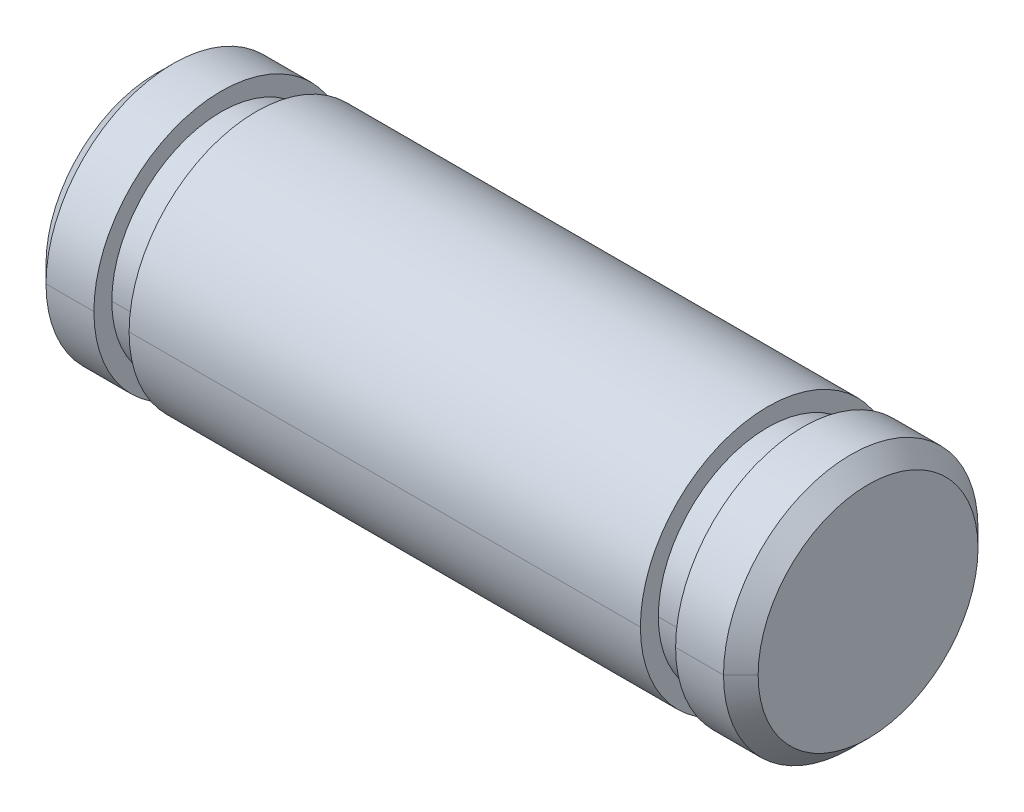
ISO-10303-21;
HEADER;
FILE_DESCRIPTION(('STEP AP214'),'2;1');
FILE_NAME('part.step','',(''),(''),'','','');
FILE_SCHEMA(('AUTOMOTIVE_DESIGN { 1 0 10303 214 1 1 1 1 }'));
ENDSEC;
DATA;
#1=APPLICATION_CONTEXT('core data for automotive mechanical design processes');
#2=APPLICATION_PROTOCOL_DEFINITION('international standard','automotive_design',2000,#1);
#3=PRODUCT_CONTEXT('',#1,'mechanical');
#4=PRODUCT('Part','Part','',(#3));
#5=PRODUCT_RELATED_PRODUCT_CATEGORY('part','',(#4));
#6=PRODUCT_DEFINITION_FORMATION('','',#4);
#7=PRODUCT_DEFINITION_CONTEXT('part definition',#1,'design');
#8=PRODUCT_DEFINITION('design','',#6,#7);
#9=PRODUCT_DEFINITION_SHAPE('','',#8);
#10=(LENGTH_UNIT() NAMED_UNIT(*) SI_UNIT(.MILLI.,.METRE.));
#11=(NAMED_UNIT(*) PLANE_ANGLE_UNIT() SI_UNIT($,.RADIAN.));
#12=(NAMED_UNIT(*) SI_UNIT($,.STERADIAN.) SOLID_ANGLE_UNIT());
#13=UNCERTAINTY_MEASURE_WITH_UNIT(LENGTH_MEASURE(1.E-05),#10,'distance_accuracy_value','');
#14=(GEOMETRIC_REPRESENTATION_CONTEXT(3) GLOBAL_UNCERTAINTY_ASSIGNED_CONTEXT((#13)) GLOBAL_UNIT_ASSIGNED_CONTEXT((#10,
#11,#12)) REPRESENTATION_CONTEXT('',''));
#15=CARTESIAN_POINT('',(0.,0.,0.));
#16=DIRECTION('',(0.,0.,1.));
#17=DIRECTION('',(1.,0.,0.));
#18=AXIS2_PLACEMENT_3D('',#15,#16,#17);
#19=CARTESIAN_POINT('',(7.4549,0.,0.));
#20=DIRECTION('',(-1.,0.,0.));
#21=DIRECTION('',(0.,-1.,0.));
#22=AXIS2_PLACEMENT_3D('',#19,#20,#21);
#23=CONICAL_SURFACE('',#22,2.80035,0.7853981634);
#24=CARTESIAN_POINT('',(7.8359,0.,0.));
#25=DIRECTION('',(1.,0.,0.));
#26=DIRECTION('',(0.,0.,-1.));
#27=AXIS2_PLACEMENT_3D('',#24,#25,#26);
#28=CIRCLE('',#27,2.41935);
#29=CARTESIAN_POINT('',(7.8359,0.,-2.41935));
#30=VERTEX_POINT('',#29);
#31=CARTESIAN_POINT('',(7.83589999999903,0.,2.41934999999903));
#32=VERTEX_POINT('',#31);
#33=EDGE_CURVE('E11',#30,#32,#28,.T.);
#34=ORIENTED_EDGE('',*,*,#33,.F.);
#35=DIRECTION('',(-0.707106781184742,0.,-0.707106781188353));
#36=VECTOR('',#35,1.);
#37=CARTESIAN_POINT('',(7.83589999999903,0.,-2.41934999999903));
#38=LINE('',#37,#36);
#39=CARTESIAN_POINT('',(7.4549,0.,-2.80035));
#40=VERTEX_POINT('',#39);
#41=EDGE_CURVE('E25',#30,#40,#38,.T.);
#42=ORIENTED_EDGE('',*,*,#41,.T.);
#43=CARTESIAN_POINT('',(7.4549,0.,0.));
#44=DIRECTION('',(1.,0.,0.));
#45=DIRECTION('',(0.,0.,-1.));
#46=AXIS2_PLACEMENT_3D('',#43,#44,#45);
#47=CIRCLE('',#46,2.80035);
#48=CARTESIAN_POINT('',(7.4549,0.,2.80035));
#49=VERTEX_POINT('',#48);
#50=EDGE_CURVE('E263',#40,#49,#47,.T.);
#51=ORIENTED_EDGE('',*,*,#50,.T.);
#52=DIRECTION('',(-0.707106781184742,0.,0.707106781188353));
#53=VECTOR('',#52,1.);
#54=CARTESIAN_POINT('',(7.83589999999903,0.,2.41934999999903));
#55=LINE('',#54,#53);
#56=EDGE_CURVE('E258',#32,#49,#55,.T.);
#57=ORIENTED_EDGE('',*,*,#56,.F.);
#58=EDGE_LOOP('',(#34,#42,#51,#57));
#59=FACE_BOUND('',#58,.T.);
#60=ADVANCED_FACE('F17',(#59),#23,.T.);
#61=CARTESIAN_POINT('',(7.4549,0.,0.));
#62=DIRECTION('',(-1.,0.,0.));
#63=DIRECTION('',(0.,1.,0.));
#64=AXIS2_PLACEMENT_3D('',#61,#62,#63);
#65=CONICAL_SURFACE('',#64,2.80035,0.7853981634);
#66=CARTESIAN_POINT('',(7.4549,0.,0.));
#67=DIRECTION('',(1.,0.,0.));
#68=DIRECTION('',(0.,0.,-1.));
#69=AXIS2_PLACEMENT_3D('',#66,#67,#68);
#70=CIRCLE('',#69,2.80035);
#71=EDGE_CURVE('E254',#49,#40,#70,.T.);
#72=ORIENTED_EDGE('',*,*,#71,.T.);
#73=ORIENTED_EDGE('',*,*,#41,.F.);
#74=CARTESIAN_POINT('',(7.8359,0.,0.));
#75=DIRECTION('',(1.,0.,0.));
#76=DIRECTION('',(0.,0.,-1.));
#77=AXIS2_PLACEMENT_3D('',#74,#75,#76);
#78=CIRCLE('',#77,2.41935);
#79=EDGE_CURVE('E249',#32,#30,#78,.T.);
#80=ORIENTED_EDGE('',*,*,#79,.F.);
#81=ORIENTED_EDGE('',*,*,#56,.T.);
#82=EDGE_LOOP('',(#72,#73,#80,#81));
#83=FACE_BOUND('',#82,.T.);
#84=ADVANCED_FACE('F277',(#83),#65,.T.);
#85=CARTESIAN_POINT('',(7.8359,2.41935,0.));
#86=DIRECTION('',(-1.,0.,0.));
#87=DIRECTION('',(0.,0.,1.));
#88=AXIS2_PLACEMENT_3D('',#85,#86,#87);
#89=PLANE('',#88);
#90=ORIENTED_EDGE('',*,*,#33,.T.);
#91=ORIENTED_EDGE('',*,*,#79,.T.);
#92=EDGE_LOOP('',(#90,#91));
#93=FACE_BOUND('',#92,.T.);
#94=ADVANCED_FACE('F355',(#93),#89,.F.);
#95=CARTESIAN_POINT('',(7.8359,0.,0.));
#96=DIRECTION('',(-1.,0.,0.));
#97=DIRECTION('',(0.,1.,0.));
#98=AXIS2_PLACEMENT_3D('',#95,#96,#97);
#99=CYLINDRICAL_SURFACE('',#98,2.80035);
#100=CARTESIAN_POINT('',(6.4008,0.,0.));
#101=DIRECTION('',(1.,0.,0.));
#102=DIRECTION('',(0.,0.,-1.));
#103=AXIS2_PLACEMENT_3D('',#100,#101,#102);
#104=CIRCLE('',#103,2.80035);
#105=CARTESIAN_POINT('',(6.4008,0.,2.80035));
#106=VERTEX_POINT('',#105);
#107=CARTESIAN_POINT('',(6.4008,0.,-2.80035));
#108=VERTEX_POINT('',#107);
#109=EDGE_CURVE('E245',#106,#108,#104,.T.);
#110=ORIENTED_EDGE('',*,*,#109,.T.);
#111=DIRECTION('',(-1.,0.,0.));
#112=VECTOR('',#111,1.);
#113=CARTESIAN_POINT('',(7.4549,0.,-2.80035));
#114=LINE('',#113,#112);
#115=EDGE_CURVE('E240',#40,#108,#114,.T.);
#116=ORIENTED_EDGE('',*,*,#115,.F.);
#117=ORIENTED_EDGE('',*,*,#71,.F.);
#118=DIRECTION('',(-1.,0.,0.));
#119=VECTOR('',#118,1.);
#120=CARTESIAN_POINT('',(7.4549,0.,2.80035));
#121=LINE('',#120,#119);
#122=EDGE_CURVE('E236',#49,#106,#121,.T.);
#123=ORIENTED_EDGE('',*,*,#122,.T.);
#124=EDGE_LOOP('',(#110,#116,#117,#123));
#125=FACE_BOUND('',#124,.T.);
#126=ADVANCED_FACE('F280',(#125),#99,.T.);
#127=CARTESIAN_POINT('',(7.8359,0.,0.));
#128=DIRECTION('',(-1.,0.,0.));
#129=DIRECTION('',(0.,-1.,0.));
#130=AXIS2_PLACEMENT_3D('',#127,#128,#129);
#131=CYLINDRICAL_SURFACE('',#130,2.80035);
#132=ORIENTED_EDGE('',*,*,#50,.F.);
#133=ORIENTED_EDGE('',*,*,#115,.T.);
#134=CARTESIAN_POINT('',(6.4008,0.,0.));
#135=DIRECTION('',(1.,0.,0.));
#136=DIRECTION('',(0.,0.,-1.));
#137=AXIS2_PLACEMENT_3D('',#134,#135,#136);
#138=CIRCLE('',#137,2.80035);
#139=EDGE_CURVE('E231',#108,#106,#138,.T.);
#140=ORIENTED_EDGE('',*,*,#139,.T.);
#141=ORIENTED_EDGE('',*,*,#122,.F.);
#142=EDGE_LOOP('',(#132,#133,#140,#141));
#143=FACE_BOUND('',#142,.T.);
#144=ADVANCED_FACE('F281',(#143),#131,.T.);
#145=CARTESIAN_POINT('',(6.4008,2.40665,0.));
#146=DIRECTION('',(1.,0.,0.));
#147=DIRECTION('',(0.,0.,-1.));
#148=AXIS2_PLACEMENT_3D('',#145,#146,#147);
#149=PLANE('',#148);
#150=ORIENTED_EDGE('',*,*,#139,.F.);
#151=ORIENTED_EDGE('',*,*,#109,.F.);
#152=EDGE_LOOP('',(#150,#151));
#153=FACE_BOUND('',#152,.T.);
#154=CARTESIAN_POINT('',(6.4008,0.,0.));
#155=DIRECTION('',(1.,0.,0.));
#156=DIRECTION('',(0.,0.,-1.));
#157=AXIS2_PLACEMENT_3D('',#154,#155,#156);
#158=CIRCLE('',#157,2.40665);
#159=CARTESIAN_POINT('',(6.4008,0.,-2.40665));
#160=VERTEX_POINT('',#159);
#161=CARTESIAN_POINT('',(6.4008,0.,2.40665));
#162=VERTEX_POINT('',#161);
#163=EDGE_CURVE('E227',#160,#162,#158,.T.);
#164=ORIENTED_EDGE('',*,*,#163,.T.);
#165=CARTESIAN_POINT('',(6.4008,0.,0.));
#166=DIRECTION('',(1.,0.,0.));
#167=DIRECTION('',(0.,0.,-1.));
#168=AXIS2_PLACEMENT_3D('',#165,#166,#167);
#169=CIRCLE('',#168,2.40665);
#170=EDGE_CURVE('E223',#162,#160,#169,.T.);
#171=ORIENTED_EDGE('',*,*,#170,.T.);
#172=EDGE_LOOP('',(#164,#171));
#173=FACE_BOUND('',#172,.T.);
#174=ADVANCED_FACE('F285',(#153,#173),#149,.F.);
#175=CARTESIAN_POINT('',(7.8359,0.,0.));
#176=DIRECTION('',(-1.,0.,0.));
#177=DIRECTION('',(0.,1.,0.));
#178=AXIS2_PLACEMENT_3D('',#175,#176,#177);
#179=CYLINDRICAL_SURFACE('',#178,2.40665);
#180=CARTESIAN_POINT('',(5.6261,0.,0.));
#181=DIRECTION('',(1.,0.,0.));
#182=DIRECTION('',(0.,0.,-1.));
#183=AXIS2_PLACEMENT_3D('',#180,#181,#182);
#184=CIRCLE('',#183,2.40665);
#185=CARTESIAN_POINT('',(5.6261,0.,2.40665));
#186=VERTEX_POINT('',#185);
#187=CARTESIAN_POINT('',(5.6261,0.,-2.40665));
#188=VERTEX_POINT('',#187);
#189=EDGE_CURVE('E219',#186,#188,#184,.T.);
#190=ORIENTED_EDGE('',*,*,#189,.T.);
#191=DIRECTION('',(-1.,0.,0.));
#192=VECTOR('',#191,1.);
#193=CARTESIAN_POINT('',(6.4008,0.,-2.40665));
#194=LINE('',#193,#192);
#195=EDGE_CURVE('E214',#160,#188,#194,.T.);
#196=ORIENTED_EDGE('',*,*,#195,.F.);
#197=ORIENTED_EDGE('',*,*,#170,.F.);
#198=DIRECTION('',(-1.,0.,0.));
#199=VECTOR('',#198,1.);
#200=CARTESIAN_POINT('',(6.4008,0.,2.40665));
#201=LINE('',#200,#199);
#202=EDGE_CURVE('E210',#162,#186,#201,.T.);
#203=ORIENTED_EDGE('',*,*,#202,.T.);
#204=EDGE_LOOP('',(#190,#196,#197,#203));
#205=FACE_BOUND('',#204,.T.);
#206=ADVANCED_FACE('F288',(#205),#179,.T.);
#207=CARTESIAN_POINT('',(7.8359,0.,0.));
#208=DIRECTION('',(-1.,0.,0.));
#209=DIRECTION('',(0.,-1.,0.));
#210=AXIS2_PLACEMENT_3D('',#207,#208,#209);
#211=CYLINDRICAL_SURFACE('',#210,2.40665);
#212=ORIENTED_EDGE('',*,*,#163,.F.);
#213=ORIENTED_EDGE('',*,*,#195,.T.);
#214=CARTESIAN_POINT('',(5.6261,0.,0.));
#215=DIRECTION('',(1.,0.,0.));
#216=DIRECTION('',(0.,0.,-1.));
#217=AXIS2_PLACEMENT_3D('',#214,#215,#216);
#218=CIRCLE('',#217,2.40665);
#219=EDGE_CURVE('E205',#188,#186,#218,.T.);
#220=ORIENTED_EDGE('',*,*,#219,.T.);
#221=ORIENTED_EDGE('',*,*,#202,.F.);
#222=EDGE_LOOP('',(#212,#213,#220,#221));
#223=FACE_BOUND('',#222,.T.);
#224=ADVANCED_FACE('F296',(#223),#211,.T.);
#225=CARTESIAN_POINT('',(5.6261,2.80035,0.));
#226=DIRECTION('',(-1.,0.,0.));
#227=DIRECTION('',(0.,0.,1.));
#228=AXIS2_PLACEMENT_3D('',#225,#226,#227);
#229=PLANE('',#228);
#230=ORIENTED_EDGE('',*,*,#219,.F.);
#231=ORIENTED_EDGE('',*,*,#189,.F.);
#232=EDGE_LOOP('',(#230,#231));
#233=FACE_BOUND('',#232,.T.);
#234=CARTESIAN_POINT('',(5.6261,0.,0.));
#235=DIRECTION('',(1.,0.,0.));
#236=DIRECTION('',(0.,0.,-1.));
#237=AXIS2_PLACEMENT_3D('',#234,#235,#236);
#238=CIRCLE('',#237,2.80035);
#239=CARTESIAN_POINT('',(5.6261,0.,-2.80035));
#240=VERTEX_POINT('',#239);
#241=CARTESIAN_POINT('',(5.6261,0.,2.80035));
#242=VERTEX_POINT('',#241);
#243=EDGE_CURVE('E201',#240,#242,#238,.T.);
#244=ORIENTED_EDGE('',*,*,#243,.T.);
#245=CARTESIAN_POINT('',(5.6261,0.,0.));
#246=DIRECTION('',(1.,0.,0.));
#247=DIRECTION('',(0.,0.,-1.));
#248=AXIS2_PLACEMENT_3D('',#245,#246,#247);
#249=CIRCLE('',#248,2.80035);
#250=EDGE_CURVE('E197',#242,#240,#249,.T.);
#251=ORIENTED_EDGE('',*,*,#250,.T.);
#252=EDGE_LOOP('',(#244,#251));
#253=FACE_BOUND('',#252,.T.);
#254=ADVANCED_FACE('F300',(#233,#253),#229,.F.);
#255=CARTESIAN_POINT('',(7.8359,0.,0.));
#256=DIRECTION('',(-1.,0.,0.));
#257=DIRECTION('',(0.,1.,0.));
#258=AXIS2_PLACEMENT_3D('',#255,#256,#257);
#259=CYLINDRICAL_SURFACE('',#258,2.80035);
#260=CARTESIAN_POINT('',(-5.6261,0.,0.));
#261=DIRECTION('',(1.,0.,0.));
#262=DIRECTION('',(0.,0.,-1.));
#263=AXIS2_PLACEMENT_3D('',#260,#261,#262);
#264=CIRCLE('',#263,2.80035);
#265=CARTESIAN_POINT('',(-5.6261,0.,2.80035));
#266=VERTEX_POINT('',#265);
#267=CARTESIAN_POINT('',(-5.6261,0.,-2.80035));
#268=VERTEX_POINT('',#267);
#269=EDGE_CURVE('E193',#266,#268,#264,.T.);
#270=ORIENTED_EDGE('',*,*,#269,.T.);
#271=DIRECTION('',(-1.,0.,0.));
#272=VECTOR('',#271,1.);
#273=CARTESIAN_POINT('',(5.6261,0.,-2.80035));
#274=LINE('',#273,#272);
#275=EDGE_CURVE('E188',#240,#268,#274,.T.);
#276=ORIENTED_EDGE('',*,*,#275,.F.);
#277=ORIENTED_EDGE('',*,*,#250,.F.);
#278=DIRECTION('',(-1.,0.,0.));
#279=VECTOR('',#278,1.);
#280=CARTESIAN_POINT('',(5.6261,0.,2.80035));
#281=LINE('',#280,#279);
#282=EDGE_CURVE('E184',#242,#266,#281,.T.);
#283=ORIENTED_EDGE('',*,*,#282,.T.);
#284=EDGE_LOOP('',(#270,#276,#277,#283));
#285=FACE_BOUND('',#284,.T.);
#286=ADVANCED_FACE('F303',(#285),#259,.T.);
#287=CARTESIAN_POINT('',(7.8359,0.,0.));
#288=DIRECTION('',(-1.,0.,0.));
#289=DIRECTION('',(0.,-1.,0.));
#290=AXIS2_PLACEMENT_3D('',#287,#288,#289);
#291=CYLINDRICAL_SURFACE('',#290,2.80035);
#292=ORIENTED_EDGE('',*,*,#243,.F.);
#293=ORIENTED_EDGE('',*,*,#275,.T.);
#294=CARTESIAN_POINT('',(-5.6261,0.,0.));
#295=DIRECTION('',(1.,0.,0.));
#296=DIRECTION('',(0.,0.,-1.));
#297=AXIS2_PLACEMENT_3D('',#294,#295,#296);
#298=CIRCLE('',#297,2.80035);
#299=EDGE_CURVE('E179',#268,#266,#298,.T.);
#300=ORIENTED_EDGE('',*,*,#299,.T.);
#301=ORIENTED_EDGE('',*,*,#282,.F.);
#302=EDGE_LOOP('',(#292,#293,#300,#301));
#303=FACE_BOUND('',#302,.T.);
#304=ADVANCED_FACE('F311',(#303),#291,.T.);
#305=CARTESIAN_POINT('',(-5.6261,2.40665,0.));
#306=DIRECTION('',(1.,0.,0.));
#307=DIRECTION('',(0.,0.,-1.));
#308=AXIS2_PLACEMENT_3D('',#305,#306,#307);
#309=PLANE('',#308);
#310=ORIENTED_EDGE('',*,*,#299,.F.);
#311=ORIENTED_EDGE('',*,*,#269,.F.);
#312=EDGE_LOOP('',(#310,#311));
#313=FACE_BOUND('',#312,.T.);
#314=CARTESIAN_POINT('',(-5.6261,0.,0.));
#315=DIRECTION('',(1.,0.,0.));
#316=DIRECTION('',(0.,0.,-1.));
#317=AXIS2_PLACEMENT_3D('',#314,#315,#316);
#318=CIRCLE('',#317,2.40665);
#319=CARTESIAN_POINT('',(-5.6261,0.,-2.40665));
#320=VERTEX_POINT('',#319);
#321=CARTESIAN_POINT('',(-5.6261,0.,2.40665));
#322=VERTEX_POINT('',#321);
#323=EDGE_CURVE('E175',#320,#322,#318,.T.);
#324=ORIENTED_EDGE('',*,*,#323,.T.);
#325=CARTESIAN_POINT('',(-5.6261,0.,0.));
#326=DIRECTION('',(1.,0.,0.));
#327=DIRECTION('',(0.,0.,-1.));
#328=AXIS2_PLACEMENT_3D('',#325,#326,#327);
#329=CIRCLE('',#328,2.40665);
#330=EDGE_CURVE('E171',#322,#320,#329,.T.);
#331=ORIENTED_EDGE('',*,*,#330,.T.);
#332=EDGE_LOOP('',(#324,#331));
#333=FACE_BOUND('',#332,.T.);
#334=ADVANCED_FACE('F315',(#313,#333),#309,.F.);
#335=CARTESIAN_POINT('',(7.8359,0.,0.));
#336=DIRECTION('',(-1.,0.,0.));
#337=DIRECTION('',(0.,1.,0.));
#338=AXIS2_PLACEMENT_3D('',#335,#336,#337);
#339=CYLINDRICAL_SURFACE('',#338,2.40665);
#340=CARTESIAN_POINT('',(-6.4008,0.,0.));
#341=DIRECTION('',(1.,0.,0.));
#342=DIRECTION('',(0.,0.,-1.));
#343=AXIS2_PLACEMENT_3D('',#340,#341,#342);
#344=CIRCLE('',#343,2.40665);
#345=CARTESIAN_POINT('',(-6.4008,0.,2.40665));
#346=VERTEX_POINT('',#345);
#347=CARTESIAN_POINT('',(-6.4008,0.,-2.40665));
#348=VERTEX_POINT('',#347);
#349=EDGE_CURVE('E167',#346,#348,#344,.T.);
#350=ORIENTED_EDGE('',*,*,#349,.T.);
#351=DIRECTION('',(-1.,0.,0.));
#352=VECTOR('',#351,1.);
#353=CARTESIAN_POINT('',(-5.6261,0.,-2.40665));
#354=LINE('',#353,#352);
#355=EDGE_CURVE('E162',#320,#348,#354,.T.);
#356=ORIENTED_EDGE('',*,*,#355,.F.);
#357=ORIENTED_EDGE('',*,*,#330,.F.);
#358=DIRECTION('',(-1.,0.,0.));
#359=VECTOR('',#358,1.);
#360=CARTESIAN_POINT('',(-5.6261,0.,2.40665));
#361=LINE('',#360,#359);
#362=EDGE_CURVE('E158',#322,#346,#361,.T.);
#363=ORIENTED_EDGE('',*,*,#362,.T.);
#364=EDGE_LOOP('',(#350,#356,#357,#363));
#365=FACE_BOUND('',#364,.T.);
#366=ADVANCED_FACE('F318',(#365),#339,.T.);
#367=CARTESIAN_POINT('',(7.8359,0.,0.));
#368=DIRECTION('',(-1.,0.,0.));
#369=DIRECTION('',(0.,-1.,0.));
#370=AXIS2_PLACEMENT_3D('',#367,#368,#369);
#371=CYLINDRICAL_SURFACE('',#370,2.40665);
#372=ORIENTED_EDGE('',*,*,#323,.F.);
#373=ORIENTED_EDGE('',*,*,#355,.T.);
#374=CARTESIAN_POINT('',(-6.4008,0.,0.));
#375=DIRECTION('',(1.,0.,0.));
#376=DIRECTION('',(0.,0.,-1.));
#377=AXIS2_PLACEMENT_3D('',#374,#375,#376);
#378=CIRCLE('',#377,2.40665);
#379=EDGE_CURVE('E153',#348,#346,#378,.T.);
#380=ORIENTED_EDGE('',*,*,#379,.T.);
#381=ORIENTED_EDGE('',*,*,#362,.F.);
#382=EDGE_LOOP('',(#372,#373,#380,#381));
#383=FACE_BOUND('',#382,.T.);
#384=ADVANCED_FACE('F326',(#383),#371,.T.);
#385=CARTESIAN_POINT('',(-6.4008,2.80035,0.));
#386=DIRECTION('',(-1.,0.,0.));
#387=DIRECTION('',(0.,0.,1.));
#388=AXIS2_PLACEMENT_3D('',#385,#386,#387);
#389=PLANE('',#388);
#390=ORIENTED_EDGE('',*,*,#379,.F.);
#391=ORIENTED_EDGE('',*,*,#349,.F.);
#392=EDGE_LOOP('',(#390,#391));
#393=FACE_BOUND('',#392,.T.);
#394=CARTESIAN_POINT('',(-6.4008,0.,0.));
#395=DIRECTION('',(1.,0.,0.));
#396=DIRECTION('',(0.,0.,-1.));
#397=AXIS2_PLACEMENT_3D('',#394,#395,#396);
#398=CIRCLE('',#397,2.80035);
#399=CARTESIAN_POINT('',(-6.4008,0.,-2.80035));
#400=VERTEX_POINT('',#399);
#401=CARTESIAN_POINT('',(-6.4008,0.,2.80035));
#402=VERTEX_POINT('',#401);
#403=EDGE_CURVE('E149',#400,#402,#398,.T.);
#404=ORIENTED_EDGE('',*,*,#403,.T.);
#405=CARTESIAN_POINT('',(-6.4008,0.,0.));
#406=DIRECTION('',(1.,0.,0.));
#407=DIRECTION('',(0.,0.,-1.));
#408=AXIS2_PLACEMENT_3D('',#405,#406,#407);
#409=CIRCLE('',#408,2.80035);
#410=EDGE_CURVE('E145',#402,#400,#409,.T.);
#411=ORIENTED_EDGE('',*,*,#410,.T.);
#412=EDGE_LOOP('',(#404,#411));
#413=FACE_BOUND('',#412,.T.);
#414=ADVANCED_FACE('F330',(#393,#413),#389,.F.);
#415=CARTESIAN_POINT('',(7.8359,0.,0.));
#416=DIRECTION('',(-1.,0.,0.));
#417=DIRECTION('',(0.,1.,0.));
#418=AXIS2_PLACEMENT_3D('',#415,#416,#417);
#419=CYLINDRICAL_SURFACE('',#418,2.80035);
#420=CARTESIAN_POINT('',(-7.4549,0.,0.));
#421=DIRECTION('',(1.,0.,0.));
#422=DIRECTION('',(0.,0.,-1.));
#423=AXIS2_PLACEMENT_3D('',#420,#421,#422);
#424=CIRCLE('',#423,2.80035);
#425=CARTESIAN_POINT('',(-7.4549,0.,2.80035));
#426=VERTEX_POINT('',#425);
#427=CARTESIAN_POINT('',(-7.4549,0.,-2.80035));
#428=VERTEX_POINT('',#427);
#429=EDGE_CURVE('E116',#426,#428,#424,.T.);
#430=ORIENTED_EDGE('',*,*,#429,.T.);
#431=DIRECTION('',(-1.,0.,0.));
#432=VECTOR('',#431,1.);
#433=CARTESIAN_POINT('',(-6.4008,0.,-2.80035));
#434=LINE('',#433,#432);
#435=EDGE_CURVE('E137',#400,#428,#434,.T.);
#436=ORIENTED_EDGE('',*,*,#435,.F.);
#437=ORIENTED_EDGE('',*,*,#410,.F.);
#438=DIRECTION('',(-1.,0.,0.));
#439=VECTOR('',#438,1.);
#440=CARTESIAN_POINT('',(-6.4008,0.,2.80035));
#441=LINE('',#440,#439);
#442=EDGE_CURVE('E133',#402,#426,#441,.T.);
#443=ORIENTED_EDGE('',*,*,#442,.T.);
#444=EDGE_LOOP('',(#430,#436,#437,#443));
#445=FACE_BOUND('',#444,.T.);
#446=ADVANCED_FACE('F333',(#445),#419,.T.);
#447=CARTESIAN_POINT('',(7.8359,0.,0.));
#448=DIRECTION('',(-1.,0.,0.));
#449=DIRECTION('',(0.,-1.,0.));
#450=AXIS2_PLACEMENT_3D('',#447,#448,#449);
#451=CYLINDRICAL_SURFACE('',#450,2.80035);
#452=ORIENTED_EDGE('',*,*,#403,.F.);
#453=ORIENTED_EDGE('',*,*,#435,.T.);
#454=CARTESIAN_POINT('',(-7.4549,0.,0.));
#455=DIRECTION('',(1.,0.,0.));
#456=DIRECTION('',(0.,0.,-1.));
#457=AXIS2_PLACEMENT_3D('',#454,#455,#456);
#458=CIRCLE('',#457,2.80035);
#459=EDGE_CURVE('E128',#428,#426,#458,.T.);
#460=ORIENTED_EDGE('',*,*,#459,.T.);
#461=ORIENTED_EDGE('',*,*,#442,.F.);
#462=EDGE_LOOP('',(#452,#453,#460,#461));
#463=FACE_BOUND('',#462,.T.);
#464=ADVANCED_FACE('F341',(#463),#451,.T.);
#465=CARTESIAN_POINT('',(-7.8359,0.,0.));
#466=DIRECTION('',(1.,0.,0.));
#467=DIRECTION('',(0.,-1.,0.));
#468=AXIS2_PLACEMENT_3D('',#465,#466,#467);
#469=CONICAL_SURFACE('',#468,2.41935,0.7853981634);
#470=ORIENTED_EDGE('',*,*,#459,.F.);
#471=DIRECTION('',(0.707106781184742,0.,-0.707106781188353));
#472=VECTOR('',#471,1.);
#473=CARTESIAN_POINT('',(-7.8359,0.,-2.41935));
#474=LINE('',#473,#472);
#475=CARTESIAN_POINT('',(-7.8359,0.,-2.41935));
#476=VERTEX_POINT('',#475);
#477=EDGE_CURVE('E108',#476,#428,#474,.T.);
#478=ORIENTED_EDGE('',*,*,#477,.F.);
#479=CARTESIAN_POINT('',(-7.8359,0.,0.));
#480=DIRECTION('',(1.,0.,0.));
#481=DIRECTION('',(0.,0.,-1.));
#482=AXIS2_PLACEMENT_3D('',#479,#480,#481);
#483=CIRCLE('',#482,2.41935);
#484=CARTESIAN_POINT('',(-7.8359,0.,2.41935));
#485=VERTEX_POINT('',#484);
#486=EDGE_CURVE('E101',#476,#485,#483,.T.);
#487=ORIENTED_EDGE('',*,*,#486,.T.);
#488=DIRECTION('',(0.707106781184743,0.,0.707106781188353));
#489=VECTOR('',#488,1.);
#490=CARTESIAN_POINT('',(-7.8359,0.,2.41935));
#491=LINE('',#490,#489);
#492=EDGE_CURVE('E105',#485,#426,#491,.T.);
#493=ORIENTED_EDGE('',*,*,#492,.T.);
#494=EDGE_LOOP('',(#470,#478,#487,#493));
#495=FACE_BOUND('',#494,.T.);
#496=ADVANCED_FACE('F104',(#495),#469,.T.);
#497=CARTESIAN_POINT('',(-7.8359,0.,0.));
#498=DIRECTION('',(1.,0.,0.));
#499=DIRECTION('',(0.,1.,0.));
#500=AXIS2_PLACEMENT_3D('',#497,#498,#499);
#501=CONICAL_SURFACE('',#500,2.41935,0.7853981634);
#502=CARTESIAN_POINT('',(-7.8359,0.,0.));
#503=DIRECTION('',(1.,0.,0.));
#504=DIRECTION('',(0.,0.,-1.));
#505=AXIS2_PLACEMENT_3D('',#502,#503,#504);
#506=CIRCLE('',#505,2.41935);
#507=EDGE_CURVE('E115',#485,#476,#506,.T.);
#508=ORIENTED_EDGE('',*,*,#507,.T.);
#509=ORIENTED_EDGE('',*,*,#477,.T.);
#510=ORIENTED_EDGE('',*,*,#429,.F.);
#511=ORIENTED_EDGE('',*,*,#492,.F.);
#512=EDGE_LOOP('',(#508,#509,#510,#511));
#513=FACE_BOUND('',#512,.T.);
#514=ADVANCED_FACE('F114',(#513),#501,.T.);
#515=CARTESIAN_POINT('',(-7.8359,0.,0.));
#516=DIRECTION('',(1.,0.,0.));
#517=DIRECTION('',(0.,0.,-1.));
#518=AXIS2_PLACEMENT_3D('',#515,#516,#517);
#519=PLANE('',#518);
#520=ORIENTED_EDGE('',*,*,#486,.F.);
#521=ORIENTED_EDGE('',*,*,#507,.F.);
#522=EDGE_LOOP('',(#520,#521));
#523=FACE_BOUND('',#522,.T.);
#524=ADVANCED_FACE('F118',(#523),#519,.F.);
#525=CLOSED_SHELL('',(#60,#84,#94,#126,#144,#174,#206,#224,#254,#286,#304,#334,#366,#384,#414,
#446,#464,#496,#514,#524));
#526=MANIFOLD_SOLID_BREP('B1',#525);
#527=ADVANCED_BREP_SHAPE_REPRESENTATION('',(#18,#526),#14);
#528=SHAPE_DEFINITION_REPRESENTATION(#9,#527);
ENDSEC;
END-ISO-10303-21;
